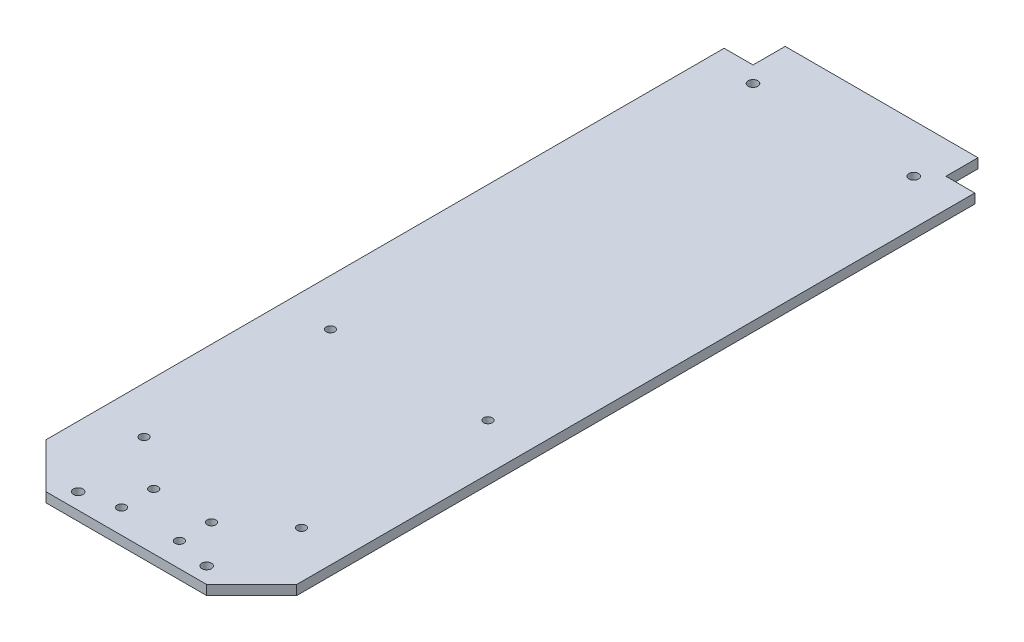
ISO-10303-21;
HEADER;
FILE_DESCRIPTION(('STEP AP214'),'2;1');
FILE_NAME('part.step','',(''),(''),'','','');
FILE_SCHEMA(('AUTOMOTIVE_DESIGN { 1 0 10303 214 1 1 1 1 }'));
ENDSEC;
DATA;
#1=APPLICATION_CONTEXT('core data for automotive mechanical design processes');
#2=APPLICATION_PROTOCOL_DEFINITION('international standard','automotive_design',2000,#1);
#3=PRODUCT_CONTEXT('',#1,'mechanical');
#4=PRODUCT('Part','Part','',(#3));
#5=PRODUCT_RELATED_PRODUCT_CATEGORY('part','',(#4));
#6=PRODUCT_DEFINITION_FORMATION('','',#4);
#7=PRODUCT_DEFINITION_CONTEXT('part definition',#1,'design');
#8=PRODUCT_DEFINITION('design','',#6,#7);
#9=PRODUCT_DEFINITION_SHAPE('','',#8);
#10=(LENGTH_UNIT() NAMED_UNIT(*) SI_UNIT(.MILLI.,.METRE.));
#11=(NAMED_UNIT(*) PLANE_ANGLE_UNIT() SI_UNIT($,.RADIAN.));
#12=(NAMED_UNIT(*) SI_UNIT($,.STERADIAN.) SOLID_ANGLE_UNIT());
#13=UNCERTAINTY_MEASURE_WITH_UNIT(LENGTH_MEASURE(1.E-05),#10,'distance_accuracy_value','');
#14=(GEOMETRIC_REPRESENTATION_CONTEXT(3) GLOBAL_UNCERTAINTY_ASSIGNED_CONTEXT((#13)) GLOBAL_UNIT_ASSIGNED_CONTEXT((#10,
#11,#12)) REPRESENTATION_CONTEXT('',''));
#15=CARTESIAN_POINT('',(0.,0.,0.));
#16=DIRECTION('',(0.,0.,1.));
#17=DIRECTION('',(1.,0.,0.));
#18=AXIS2_PLACEMENT_3D('',#15,#16,#17);
#19=CARTESIAN_POINT('',(28.1206219769056,3.,-112.5));
#20=DIRECTION('',(-1.,0.,0.));
#21=DIRECTION('',(0.,0.,1.));
#22=AXIS2_PLACEMENT_3D('',#19,#20,#21);
#23=PLANE('',#22);
#24=DIRECTION('',(0.,0.,-1.));
#25=VECTOR('',#24,1.);
#26=CARTESIAN_POINT('',(28.1206219769056,3.,-112.5));
#27=LINE('',#26,#25);
#28=CARTESIAN_POINT('',(28.1206219769056,3.,98.5));
#29=VERTEX_POINT('',#28);
#30=CARTESIAN_POINT('',(28.1206219769056,3.,-112.5));
#31=VERTEX_POINT('',#30);
#32=EDGE_CURVE('E111',#29,#31,#27,.T.);
#33=ORIENTED_EDGE('',*,*,#32,.F.);
#34=DIRECTION('',(0.,-1.,0.));
#35=VECTOR('',#34,1.);
#36=CARTESIAN_POINT('',(28.1206219769056,3.,98.5));
#37=LINE('',#36,#35);
#38=CARTESIAN_POINT('',(28.1206219769056,0.,98.5));
#39=VERTEX_POINT('',#38);
#40=EDGE_CURVE('E11',#29,#39,#37,.T.);
#41=ORIENTED_EDGE('',*,*,#40,.T.);
#42=DIRECTION('',(0.,0.,-1.));
#43=VECTOR('',#42,1.);
#44=CARTESIAN_POINT('',(28.1206219769056,0.,-112.5));
#45=LINE('',#44,#43);
#46=CARTESIAN_POINT('',(28.1206219769056,0.,-112.5));
#47=VERTEX_POINT('',#46);
#48=EDGE_CURVE('E131',#39,#47,#45,.T.);
#49=ORIENTED_EDGE('',*,*,#48,.T.);
#50=DIRECTION('',(0.,-1.,0.));
#51=VECTOR('',#50,1.);
#52=CARTESIAN_POINT('',(28.1206219769056,3.,-112.5));
#53=LINE('',#52,#51);
#54=EDGE_CURVE('E124',#31,#47,#53,.T.);
#55=ORIENTED_EDGE('',*,*,#54,.F.);
#56=EDGE_LOOP('',(#33,#41,#49,#55));
#57=FACE_BOUND('',#56,.T.);
#58=ADVANCED_FACE('F34',(#57),#23,.F.);
#59=CARTESIAN_POINT('',(19.1206219769056,3.,-112.5));
#60=DIRECTION('',(0.,0.,1.));
#61=DIRECTION('',(1.,0.,0.));
#62=AXIS2_PLACEMENT_3D('',#59,#60,#61);
#63=PLANE('',#62);
#64=DIRECTION('',(-1.,0.,0.));
#65=VECTOR('',#64,1.);
#66=CARTESIAN_POINT('',(19.1206219769056,0.,-112.5));
#67=LINE('',#66,#65);
#68=CARTESIAN_POINT('',(19.1206219769056,0.,-112.5));
#69=VERTEX_POINT('',#68);
#70=EDGE_CURVE('E234',#47,#69,#67,.T.);
#71=ORIENTED_EDGE('',*,*,#70,.T.);
#72=DIRECTION('',(0.,-1.,0.));
#73=VECTOR('',#72,1.);
#74=CARTESIAN_POINT('',(19.1206219769056,3.,-112.5));
#75=LINE('',#74,#73);
#76=CARTESIAN_POINT('',(19.1206219769056,3.,-112.5));
#77=VERTEX_POINT('',#76);
#78=EDGE_CURVE('E126',#77,#69,#75,.T.);
#79=ORIENTED_EDGE('',*,*,#78,.F.);
#80=DIRECTION('',(-1.,0.,0.));
#81=VECTOR('',#80,1.);
#82=CARTESIAN_POINT('',(19.1206219769056,3.,-112.5));
#83=LINE('',#82,#81);
#84=EDGE_CURVE('E114',#31,#77,#83,.T.);
#85=ORIENTED_EDGE('',*,*,#84,.F.);
#86=ORIENTED_EDGE('',*,*,#54,.T.);
#87=EDGE_LOOP('',(#71,#79,#85,#86));
#88=FACE_BOUND('',#87,.T.);
#89=ADVANCED_FACE('F123',(#88),#63,.F.);
#90=CARTESIAN_POINT('',(19.1206219769056,3.,-112.5));
#91=DIRECTION('',(-1.,0.,0.));
#92=DIRECTION('',(0.,0.,1.));
#93=AXIS2_PLACEMENT_3D('',#90,#91,#92);
#94=PLANE('',#93);
#95=DIRECTION('',(0.,0.,-1.));
#96=VECTOR('',#95,1.);
#97=CARTESIAN_POINT('',(19.1206219769056,0.,-112.5));
#98=LINE('',#97,#96);
#99=CARTESIAN_POINT('',(19.1206219769056,0.,-122.5));
#100=VERTEX_POINT('',#99);
#101=EDGE_CURVE('E232',#69,#100,#98,.T.);
#102=ORIENTED_EDGE('',*,*,#101,.T.);
#103=DIRECTION('',(0.,-1.,0.));
#104=VECTOR('',#103,1.);
#105=CARTESIAN_POINT('',(19.1206219769056,3.,-122.5));
#106=LINE('',#105,#104);
#107=CARTESIAN_POINT('',(19.1206219769056,3.,-122.5));
#108=VERTEX_POINT('',#107);
#109=EDGE_CURVE('E137',#108,#100,#106,.T.);
#110=ORIENTED_EDGE('',*,*,#109,.F.);
#111=DIRECTION('',(0.,0.,-1.));
#112=VECTOR('',#111,1.);
#113=CARTESIAN_POINT('',(19.1206219769056,3.,-112.5));
#114=LINE('',#113,#112);
#115=EDGE_CURVE('E128',#77,#108,#114,.T.);
#116=ORIENTED_EDGE('',*,*,#115,.F.);
#117=ORIENTED_EDGE('',*,*,#78,.T.);
#118=EDGE_LOOP('',(#102,#110,#116,#117));
#119=FACE_BOUND('',#118,.T.);
#120=ADVANCED_FACE('F314',(#119),#94,.F.);
#121=CARTESIAN_POINT('',(-40.8793780230944,3.,-122.5));
#122=DIRECTION('',(0.,0.,1.));
#123=DIRECTION('',(1.,0.,0.));
#124=AXIS2_PLACEMENT_3D('',#121,#122,#123);
#125=PLANE('',#124);
#126=DIRECTION('',(-1.,0.,0.));
#127=VECTOR('',#126,1.);
#128=CARTESIAN_POINT('',(-40.8793780230944,0.,-122.5));
#129=LINE('',#128,#127);
#130=CARTESIAN_POINT('',(-40.8793780230944,0.,-122.5));
#131=VERTEX_POINT('',#130);
#132=EDGE_CURVE('E227',#100,#131,#129,.T.);
#133=ORIENTED_EDGE('',*,*,#132,.T.);
#134=DIRECTION('',(0.,-1.,0.));
#135=VECTOR('',#134,1.);
#136=CARTESIAN_POINT('',(-40.8793780230944,3.,-122.5));
#137=LINE('',#136,#135);
#138=CARTESIAN_POINT('',(-40.8793780230944,3.,-122.5));
#139=VERTEX_POINT('',#138);
#140=EDGE_CURVE('E218',#139,#131,#137,.T.);
#141=ORIENTED_EDGE('',*,*,#140,.F.);
#142=DIRECTION('',(-1.,0.,0.));
#143=VECTOR('',#142,1.);
#144=CARTESIAN_POINT('',(-40.8793780230944,3.,-122.5));
#145=LINE('',#144,#143);
#146=EDGE_CURVE('E228',#108,#139,#145,.T.);
#147=ORIENTED_EDGE('',*,*,#146,.F.);
#148=ORIENTED_EDGE('',*,*,#109,.T.);
#149=EDGE_LOOP('',(#133,#141,#147,#148));
#150=FACE_BOUND('',#149,.T.);
#151=ADVANCED_FACE('F225',(#150),#125,.F.);
#152=CARTESIAN_POINT('',(-40.8793780230944,3.,-112.5));
#153=DIRECTION('',(1.,0.,0.));
#154=DIRECTION('',(0.,0.,-1.));
#155=AXIS2_PLACEMENT_3D('',#152,#153,#154);
#156=PLANE('',#155);
#157=DIRECTION('',(0.,0.,1.));
#158=VECTOR('',#157,1.);
#159=CARTESIAN_POINT('',(-40.8793780230944,0.,-112.5));
#160=LINE('',#159,#158);
#161=CARTESIAN_POINT('',(-40.8793780230944,0.,-112.5));
#162=VERTEX_POINT('',#161);
#163=EDGE_CURVE('E210',#131,#162,#160,.T.);
#164=ORIENTED_EDGE('',*,*,#163,.T.);
#165=DIRECTION('',(0.,-1.,0.));
#166=VECTOR('',#165,1.);
#167=CARTESIAN_POINT('',(-40.8793780230944,3.,-112.5));
#168=LINE('',#167,#166);
#169=CARTESIAN_POINT('',(-40.8793780230944,3.,-112.5));
#170=VERTEX_POINT('',#169);
#171=EDGE_CURVE('E215',#170,#162,#168,.T.);
#172=ORIENTED_EDGE('',*,*,#171,.F.);
#173=DIRECTION('',(0.,0.,1.));
#174=VECTOR('',#173,1.);
#175=CARTESIAN_POINT('',(-40.8793780230944,3.,-112.5));
#176=LINE('',#175,#174);
#177=EDGE_CURVE('E242',#139,#170,#176,.T.);
#178=ORIENTED_EDGE('',*,*,#177,.F.);
#179=ORIENTED_EDGE('',*,*,#140,.T.);
#180=EDGE_LOOP('',(#164,#172,#178,#179));
#181=FACE_BOUND('',#180,.T.);
#182=ADVANCED_FACE('F519',(#181),#156,.F.);
#183=CARTESIAN_POINT('',(-49.8793780230944,3.,-112.5));
#184=DIRECTION('',(0.,0.,1.));
#185=DIRECTION('',(1.,0.,0.));
#186=AXIS2_PLACEMENT_3D('',#183,#184,#185);
#187=PLANE('',#186);
#188=DIRECTION('',(-1.,0.,0.));
#189=VECTOR('',#188,1.);
#190=CARTESIAN_POINT('',(-49.8793780230944,0.,-112.5));
#191=LINE('',#190,#189);
#192=CARTESIAN_POINT('',(-49.8793780230944,0.,-112.5));
#193=VERTEX_POINT('',#192);
#194=EDGE_CURVE('E207',#162,#193,#191,.T.);
#195=ORIENTED_EDGE('',*,*,#194,.T.);
#196=DIRECTION('',(0.,-1.,0.));
#197=VECTOR('',#196,1.);
#198=CARTESIAN_POINT('',(-49.8793780230944,3.,-112.5));
#199=LINE('',#198,#197);
#200=CARTESIAN_POINT('',(-49.8793780230944,3.,-112.5));
#201=VERTEX_POINT('',#200);
#202=EDGE_CURVE('E196',#201,#193,#199,.T.);
#203=ORIENTED_EDGE('',*,*,#202,.F.);
#204=DIRECTION('',(-1.,0.,0.));
#205=VECTOR('',#204,1.);
#206=CARTESIAN_POINT('',(-49.8793780230944,3.,-112.5));
#207=LINE('',#206,#205);
#208=EDGE_CURVE('E240',#170,#201,#207,.T.);
#209=ORIENTED_EDGE('',*,*,#208,.F.);
#210=ORIENTED_EDGE('',*,*,#171,.T.);
#211=EDGE_LOOP('',(#195,#203,#209,#210));
#212=FACE_BOUND('',#211,.T.);
#213=ADVANCED_FACE('F433',(#212),#187,.F.);
#214=CARTESIAN_POINT('',(-49.8793780230944,3.,-112.5));
#215=DIRECTION('',(1.,0.,0.));
#216=DIRECTION('',(0.,0.,-1.));
#217=AXIS2_PLACEMENT_3D('',#214,#215,#216);
#218=PLANE('',#217);
#219=DIRECTION('',(0.,0.,1.));
#220=VECTOR('',#219,1.);
#221=CARTESIAN_POINT('',(-49.8793780230944,0.,-112.5));
#222=LINE('',#221,#220);
#223=CARTESIAN_POINT('',(-49.8793780230944,0.,98.4999999999999));
#224=VERTEX_POINT('',#223);
#225=EDGE_CURVE('E203',#193,#224,#222,.T.);
#226=ORIENTED_EDGE('',*,*,#225,.T.);
#227=DIRECTION('',(0.,1.,0.));
#228=VECTOR('',#227,1.);
#229=CARTESIAN_POINT('',(-49.8793780230944,3.,98.4999999999999));
#230=LINE('',#229,#228);
#231=CARTESIAN_POINT('',(-49.8793780230944,3.,98.4999999999999));
#232=VERTEX_POINT('',#231);
#233=EDGE_CURVE('E57',#224,#232,#230,.T.);
#234=ORIENTED_EDGE('',*,*,#233,.T.);
#235=DIRECTION('',(0.,0.,1.));
#236=VECTOR('',#235,1.);
#237=CARTESIAN_POINT('',(-49.8793780230944,3.,-112.5));
#238=LINE('',#237,#236);
#239=EDGE_CURVE('E188',#201,#232,#238,.T.);
#240=ORIENTED_EDGE('',*,*,#239,.F.);
#241=ORIENTED_EDGE('',*,*,#202,.T.);
#242=EDGE_LOOP('',(#226,#234,#240,#241));
#243=FACE_BOUND('',#242,.T.);
#244=ADVANCED_FACE('F205',(#243),#218,.F.);
#245=CARTESIAN_POINT('',(-49.8793780230944,3.,112.5));
#246=DIRECTION('',(0.,0.,-1.));
#247=DIRECTION('',(-1.,0.,0.));
#248=AXIS2_PLACEMENT_3D('',#245,#246,#247);
#249=PLANE('',#248);
#250=DIRECTION('',(1.,0.,0.));
#251=VECTOR('',#250,1.);
#252=CARTESIAN_POINT('',(-49.8793780230944,3.,112.5));
#253=LINE('',#252,#251);
#254=CARTESIAN_POINT('',(-35.8793780230944,3.,112.5));
#255=VERTEX_POINT('',#254);
#256=CARTESIAN_POINT('',(14.1206219769056,3.,112.5));
#257=VERTEX_POINT('',#256);
#258=EDGE_CURVE('E187',#255,#257,#253,.T.);
#259=ORIENTED_EDGE('',*,*,#258,.F.);
#260=DIRECTION('',(0.,-1.,0.));
#261=VECTOR('',#260,1.);
#262=CARTESIAN_POINT('',(-35.8793780230944,3.,112.5));
#263=LINE('',#262,#261);
#264=CARTESIAN_POINT('',(-35.8793780230944,0.,112.5));
#265=VERTEX_POINT('',#264);
#266=EDGE_CURVE('E135',#255,#265,#263,.T.);
#267=ORIENTED_EDGE('',*,*,#266,.T.);
#268=DIRECTION('',(1.,0.,0.));
#269=VECTOR('',#268,1.);
#270=CARTESIAN_POINT('',(-49.8793780230944,0.,112.5));
#271=LINE('',#270,#269);
#272=CARTESIAN_POINT('',(14.1206219769056,0.,112.5));
#273=VERTEX_POINT('',#272);
#274=EDGE_CURVE('E119',#265,#273,#271,.T.);
#275=ORIENTED_EDGE('',*,*,#274,.T.);
#276=DIRECTION('',(0.,1.,0.));
#277=VECTOR('',#276,1.);
#278=CARTESIAN_POINT('',(14.1206219769056,3.,112.5));
#279=LINE('',#278,#277);
#280=EDGE_CURVE('E133',#273,#257,#279,.T.);
#281=ORIENTED_EDGE('',*,*,#280,.T.);
#282=EDGE_LOOP('',(#259,#267,#275,#281));
#283=FACE_BOUND('',#282,.T.);
#284=ADVANCED_FACE('F192',(#283),#249,.F.);
#285=CARTESIAN_POINT('',(0.,3.,0.));
#286=DIRECTION('',(0.,1.,0.));
#287=DIRECTION('',(0.,0.,1.));
#288=AXIS2_PLACEMENT_3D('',#285,#286,#287);
#289=PLANE('',#288);
#290=CARTESIAN_POINT('',(-1.87937802309441,3.,105.));
#291=DIRECTION('',(0.,1.,0.));
#292=DIRECTION('',(0.,0.,1.));
#293=AXIS2_PLACEMENT_3D('',#290,#291,#292);
#294=CIRCLE('',#293,1.35);
#295=CARTESIAN_POINT('',(-1.87937802309441,3.,106.35));
#296=VERTEX_POINT('',#295);
#297=EDGE_CURVE('E261',#296,#296,#294,.T.);
#298=ORIENTED_EDGE('',*,*,#297,.F.);
#299=EDGE_LOOP('',(#298));
#300=FACE_BOUND('',#299,.T.);
#301=CARTESIAN_POINT('',(-35.3793780230944,3.,24.5));
#302=DIRECTION('',(0.,1.,0.));
#303=DIRECTION('',(0.,0.,1.));
#304=AXIS2_PLACEMENT_3D('',#301,#302,#303);
#305=CIRCLE('',#304,1.35);
#306=CARTESIAN_POINT('',(-35.3793780230944,3.,25.85));
#307=VERTEX_POINT('',#306);
#308=EDGE_CURVE('E264',#307,#307,#305,.T.);
#309=ORIENTED_EDGE('',*,*,#308,.F.);
#310=EDGE_LOOP('',(#309));
#311=FACE_BOUND('',#310,.T.);
#312=CARTESIAN_POINT('',(13.6206219769056,3.,24.5));
#313=DIRECTION('',(0.,1.,0.));
#314=DIRECTION('',(0.,0.,1.));
#315=AXIS2_PLACEMENT_3D('',#312,#313,#314);
#316=CIRCLE('',#315,1.35);
#317=CARTESIAN_POINT('',(13.6206219769056,3.,25.85));
#318=VERTEX_POINT('',#317);
#319=EDGE_CURVE('E268',#318,#318,#316,.T.);
#320=ORIENTED_EDGE('',*,*,#319,.F.);
#321=EDGE_LOOP('',(#320));
#322=FACE_BOUND('',#321,.T.);
#323=CARTESIAN_POINT('',(13.6206219769056,3.,82.5));
#324=DIRECTION('',(0.,1.,0.));
#325=DIRECTION('',(0.,0.,1.));
#326=AXIS2_PLACEMENT_3D('',#323,#324,#325);
#327=CIRCLE('',#326,1.35);
#328=CARTESIAN_POINT('',(13.6206219769056,3.,83.85));
#329=VERTEX_POINT('',#328);
#330=EDGE_CURVE('E258',#329,#329,#327,.T.);
#331=ORIENTED_EDGE('',*,*,#330,.F.);
#332=EDGE_LOOP('',(#331));
#333=FACE_BOUND('',#332,.T.);
#334=CARTESIAN_POINT('',(-35.8793780230944,3.,-107.5));
#335=DIRECTION('',(0.,1.,0.));
#336=DIRECTION('',(0.,0.,1.));
#337=AXIS2_PLACEMENT_3D('',#334,#335,#336);
#338=CIRCLE('',#337,1.5);
#339=CARTESIAN_POINT('',(-35.8793780230944,3.,-106.));
#340=VERTEX_POINT('',#339);
#341=EDGE_CURVE('E248',#340,#340,#338,.T.);
#342=ORIENTED_EDGE('',*,*,#341,.F.);
#343=EDGE_LOOP('',(#342));
#344=FACE_BOUND('',#343,.T.);
#345=CARTESIAN_POINT('',(9.12062197690559,3.,107.5));
#346=DIRECTION('',(0.,1.,0.));
#347=DIRECTION('',(0.,0.,1.));
#348=AXIS2_PLACEMENT_3D('',#345,#346,#347);
#349=CIRCLE('',#348,1.5);
#350=CARTESIAN_POINT('',(9.12062197690559,3.,109.));
#351=VERTEX_POINT('',#350);
#352=EDGE_CURVE('E249',#351,#351,#349,.T.);
#353=ORIENTED_EDGE('',*,*,#352,.F.);
#354=EDGE_LOOP('',(#353));
#355=FACE_BOUND('',#354,.T.);
#356=CARTESIAN_POINT('',(-30.8793780230944,3.,107.5));
#357=DIRECTION('',(0.,1.,0.));
#358=DIRECTION('',(0.,0.,1.));
#359=AXIS2_PLACEMENT_3D('',#356,#357,#358);
#360=CIRCLE('',#359,1.5);
#361=CARTESIAN_POINT('',(-30.8793780230944,3.,109.));
#362=VERTEX_POINT('',#361);
#363=EDGE_CURVE('E252',#362,#362,#360,.T.);
#364=ORIENTED_EDGE('',*,*,#363,.F.);
#365=EDGE_LOOP('',(#364));
#366=FACE_BOUND('',#365,.T.);
#367=CARTESIAN_POINT('',(-35.3793780230944,3.,82.5));
#368=DIRECTION('',(0.,1.,0.));
#369=DIRECTION('',(0.,0.,1.));
#370=AXIS2_PLACEMENT_3D('',#367,#368,#369);
#371=CIRCLE('',#370,1.35);
#372=CARTESIAN_POINT('',(-35.3793780230944,3.,83.85));
#373=VERTEX_POINT('',#372);
#374=EDGE_CURVE('E255',#373,#373,#371,.T.);
#375=ORIENTED_EDGE('',*,*,#374,.F.);
#376=EDGE_LOOP('',(#375));
#377=FACE_BOUND('',#376,.T.);
#378=CARTESIAN_POINT('',(-19.8793780230944,3.,95.));
#379=DIRECTION('',(0.,1.,0.));
#380=DIRECTION('',(0.,0.,1.));
#381=AXIS2_PLACEMENT_3D('',#378,#379,#380);
#382=CIRCLE('',#381,1.35);
#383=CARTESIAN_POINT('',(-19.8793780230944,3.,96.35));
#384=VERTEX_POINT('',#383);
#385=EDGE_CURVE('E265',#384,#384,#382,.T.);
#386=ORIENTED_EDGE('',*,*,#385,.F.);
#387=EDGE_LOOP('',(#386));
#388=FACE_BOUND('',#387,.T.);
#389=CARTESIAN_POINT('',(-19.8793780230944,3.,105.));
#390=DIRECTION('',(0.,1.,0.));
#391=DIRECTION('',(0.,0.,1.));
#392=AXIS2_PLACEMENT_3D('',#389,#390,#391);
#393=CIRCLE('',#392,1.35);
#394=CARTESIAN_POINT('',(-19.8793780230944,3.,106.35));
#395=VERTEX_POINT('',#394);
#396=EDGE_CURVE('E276',#395,#395,#393,.T.);
#397=ORIENTED_EDGE('',*,*,#396,.F.);
#398=EDGE_LOOP('',(#397));
#399=FACE_BOUND('',#398,.T.);
#400=CARTESIAN_POINT('',(-1.87937802309441,3.,95.));
#401=DIRECTION('',(0.,1.,0.));
#402=DIRECTION('',(0.,0.,1.));
#403=AXIS2_PLACEMENT_3D('',#400,#401,#402);
#404=CIRCLE('',#403,1.35);
#405=CARTESIAN_POINT('',(-1.87937802309441,3.,96.35));
#406=VERTEX_POINT('',#405);
#407=EDGE_CURVE('E273',#406,#406,#404,.T.);
#408=ORIENTED_EDGE('',*,*,#407,.F.);
#409=EDGE_LOOP('',(#408));
#410=FACE_BOUND('',#409,.T.);
#411=CARTESIAN_POINT('',(14.1206219769056,3.,-107.5));
#412=DIRECTION('',(0.,1.,0.));
#413=DIRECTION('',(0.,0.,1.));
#414=AXIS2_PLACEMENT_3D('',#411,#412,#413);
#415=CIRCLE('',#414,1.5);
#416=CARTESIAN_POINT('',(14.1206219769056,3.,-106.));
#417=VERTEX_POINT('',#416);
#418=EDGE_CURVE('E145',#417,#417,#415,.T.);
#419=ORIENTED_EDGE('',*,*,#418,.F.);
#420=EDGE_LOOP('',(#419));
#421=FACE_BOUND('',#420,.T.);
#422=ORIENTED_EDGE('',*,*,#239,.T.);
#423=DIRECTION('',(-0.707106781186545,0.,-0.70710678118655));
#424=VECTOR('',#423,1.);
#425=CARTESIAN_POINT('',(-74.1896890115473,3.,74.1896890115468));
#426=LINE('',#425,#424);
#427=EDGE_CURVE('E42',#232,#255,#426,.F.);
#428=ORIENTED_EDGE('',*,*,#427,.T.);
#429=ORIENTED_EDGE('',*,*,#258,.T.);
#430=DIRECTION('',(-0.707106781186549,0.,0.707106781186546));
#431=VECTOR('',#430,1.);
#432=CARTESIAN_POINT('',(63.3103109884528,3.,63.310310988453));
#433=LINE('',#432,#431);
#434=EDGE_CURVE('E49',#257,#29,#433,.F.);
#435=ORIENTED_EDGE('',*,*,#434,.T.);
#436=ORIENTED_EDGE('',*,*,#32,.T.);
#437=ORIENTED_EDGE('',*,*,#84,.T.);
#438=ORIENTED_EDGE('',*,*,#115,.T.);
#439=ORIENTED_EDGE('',*,*,#146,.T.);
#440=ORIENTED_EDGE('',*,*,#177,.T.);
#441=ORIENTED_EDGE('',*,*,#208,.T.);
#442=EDGE_LOOP('',(#422,#428,#429,#435,#436,#437,#438,#439,#440,#441));
#443=FACE_BOUND('',#442,.T.);
#444=ADVANCED_FACE('F113',(#300,#311,#322,#333,#344,#355,#366,#377,#388,#399,#410,#421,#443),
#289,.T.);
#445=CARTESIAN_POINT('',(0.,0.,0.));
#446=DIRECTION('',(0.,1.,0.));
#447=DIRECTION('',(0.,0.,1.));
#448=AXIS2_PLACEMENT_3D('',#445,#446,#447);
#449=PLANE('',#448);
#450=CARTESIAN_POINT('',(-1.87937802309441,0.,105.));
#451=DIRECTION('',(0.,1.,0.));
#452=DIRECTION('',(0.,0.,1.));
#453=AXIS2_PLACEMENT_3D('',#450,#451,#452);
#454=CIRCLE('',#453,1.35);
#455=CARTESIAN_POINT('',(-1.87937802309441,0.,106.35));
#456=VERTEX_POINT('',#455);
#457=EDGE_CURVE('E175',#456,#456,#454,.T.);
#458=ORIENTED_EDGE('',*,*,#457,.T.);
#459=EDGE_LOOP('',(#458));
#460=FACE_BOUND('',#459,.T.);
#461=CARTESIAN_POINT('',(-35.3793780230944,0.,24.5));
#462=DIRECTION('',(0.,1.,0.));
#463=DIRECTION('',(0.,0.,1.));
#464=AXIS2_PLACEMENT_3D('',#461,#462,#463);
#465=CIRCLE('',#464,1.35);
#466=CARTESIAN_POINT('',(-35.3793780230944,0.,25.85));
#467=VERTEX_POINT('',#466);
#468=EDGE_CURVE('E172',#467,#467,#465,.T.);
#469=ORIENTED_EDGE('',*,*,#468,.T.);
#470=EDGE_LOOP('',(#469));
#471=FACE_BOUND('',#470,.T.);
#472=CARTESIAN_POINT('',(13.6206219769056,0.,24.5));
#473=DIRECTION('',(0.,1.,0.));
#474=DIRECTION('',(0.,0.,1.));
#475=AXIS2_PLACEMENT_3D('',#472,#473,#474);
#476=CIRCLE('',#475,1.35);
#477=CARTESIAN_POINT('',(13.6206219769056,0.,25.85));
#478=VERTEX_POINT('',#477);
#479=EDGE_CURVE('E169',#478,#478,#476,.T.);
#480=ORIENTED_EDGE('',*,*,#479,.T.);
#481=EDGE_LOOP('',(#480));
#482=FACE_BOUND('',#481,.T.);
#483=CARTESIAN_POINT('',(13.6206219769056,0.,82.5));
#484=DIRECTION('',(0.,1.,0.));
#485=DIRECTION('',(0.,0.,1.));
#486=AXIS2_PLACEMENT_3D('',#483,#484,#485);
#487=CIRCLE('',#486,1.35);
#488=CARTESIAN_POINT('',(13.6206219769056,0.,83.85));
#489=VERTEX_POINT('',#488);
#490=EDGE_CURVE('E166',#489,#489,#487,.T.);
#491=ORIENTED_EDGE('',*,*,#490,.T.);
#492=EDGE_LOOP('',(#491));
#493=FACE_BOUND('',#492,.T.);
#494=CARTESIAN_POINT('',(-35.8793780230944,0.,-107.5));
#495=DIRECTION('',(0.,1.,0.));
#496=DIRECTION('',(0.,0.,1.));
#497=AXIS2_PLACEMENT_3D('',#494,#495,#496);
#498=CIRCLE('',#497,1.5);
#499=CARTESIAN_POINT('',(-35.8793780230944,0.,-106.));
#500=VERTEX_POINT('',#499);
#501=EDGE_CURVE('E163',#500,#500,#498,.T.);
#502=ORIENTED_EDGE('',*,*,#501,.T.);
#503=EDGE_LOOP('',(#502));
#504=FACE_BOUND('',#503,.T.);
#505=CARTESIAN_POINT('',(9.12062197690559,0.,107.5));
#506=DIRECTION('',(0.,1.,0.));
#507=DIRECTION('',(0.,0.,1.));
#508=AXIS2_PLACEMENT_3D('',#505,#506,#507);
#509=CIRCLE('',#508,1.5);
#510=CARTESIAN_POINT('',(9.12062197690559,0.,109.));
#511=VERTEX_POINT('',#510);
#512=EDGE_CURVE('E160',#511,#511,#509,.T.);
#513=ORIENTED_EDGE('',*,*,#512,.T.);
#514=EDGE_LOOP('',(#513));
#515=FACE_BOUND('',#514,.T.);
#516=CARTESIAN_POINT('',(-30.8793780230944,0.,107.5));
#517=DIRECTION('',(0.,1.,0.));
#518=DIRECTION('',(0.,0.,1.));
#519=AXIS2_PLACEMENT_3D('',#516,#517,#518);
#520=CIRCLE('',#519,1.5);
#521=CARTESIAN_POINT('',(-30.8793780230944,0.,109.));
#522=VERTEX_POINT('',#521);
#523=EDGE_CURVE('E157',#522,#522,#520,.T.);
#524=ORIENTED_EDGE('',*,*,#523,.T.);
#525=EDGE_LOOP('',(#524));
#526=FACE_BOUND('',#525,.T.);
#527=CARTESIAN_POINT('',(-35.3793780230944,0.,82.5));
#528=DIRECTION('',(0.,1.,0.));
#529=DIRECTION('',(0.,0.,1.));
#530=AXIS2_PLACEMENT_3D('',#527,#528,#529);
#531=CIRCLE('',#530,1.35);
#532=CARTESIAN_POINT('',(-35.3793780230944,0.,83.85));
#533=VERTEX_POINT('',#532);
#534=EDGE_CURVE('E154',#533,#533,#531,.T.);
#535=ORIENTED_EDGE('',*,*,#534,.T.);
#536=EDGE_LOOP('',(#535));
#537=FACE_BOUND('',#536,.T.);
#538=CARTESIAN_POINT('',(-19.8793780230944,0.,95.));
#539=DIRECTION('',(0.,1.,0.));
#540=DIRECTION('',(0.,0.,1.));
#541=AXIS2_PLACEMENT_3D('',#538,#539,#540);
#542=CIRCLE('',#541,1.35);
#543=CARTESIAN_POINT('',(-19.8793780230944,0.,96.35));
#544=VERTEX_POINT('',#543);
#545=EDGE_CURVE('E151',#544,#544,#542,.T.);
#546=ORIENTED_EDGE('',*,*,#545,.T.);
#547=EDGE_LOOP('',(#546));
#548=FACE_BOUND('',#547,.T.);
#549=CARTESIAN_POINT('',(-19.8793780230944,0.,105.));
#550=DIRECTION('',(0.,1.,0.));
#551=DIRECTION('',(0.,0.,1.));
#552=AXIS2_PLACEMENT_3D('',#549,#550,#551);
#553=CIRCLE('',#552,1.35);
#554=CARTESIAN_POINT('',(-19.8793780230944,0.,106.35));
#555=VERTEX_POINT('',#554);
#556=EDGE_CURVE('E148',#555,#555,#553,.T.);
#557=ORIENTED_EDGE('',*,*,#556,.T.);
#558=EDGE_LOOP('',(#557));
#559=FACE_BOUND('',#558,.T.);
#560=CARTESIAN_POINT('',(-1.87937802309441,0.,95.));
#561=DIRECTION('',(0.,1.,0.));
#562=DIRECTION('',(0.,0.,1.));
#563=AXIS2_PLACEMENT_3D('',#560,#561,#562);
#564=CIRCLE('',#563,1.35);
#565=CARTESIAN_POINT('',(-1.87937802309441,0.,96.35));
#566=VERTEX_POINT('',#565);
#567=EDGE_CURVE('E144',#566,#566,#564,.T.);
#568=ORIENTED_EDGE('',*,*,#567,.T.);
#569=EDGE_LOOP('',(#568));
#570=FACE_BOUND('',#569,.T.);
#571=CARTESIAN_POINT('',(14.1206219769056,0.,-107.5));
#572=DIRECTION('',(0.,1.,0.));
#573=DIRECTION('',(0.,0.,1.));
#574=AXIS2_PLACEMENT_3D('',#571,#572,#573);
#575=CIRCLE('',#574,1.5);
#576=CARTESIAN_POINT('',(14.1206219769056,0.,-106.));
#577=VERTEX_POINT('',#576);
#578=EDGE_CURVE('E141',#577,#577,#575,.T.);
#579=ORIENTED_EDGE('',*,*,#578,.T.);
#580=EDGE_LOOP('',(#579));
#581=FACE_BOUND('',#580,.T.);
#582=ORIENTED_EDGE('',*,*,#274,.F.);
#583=DIRECTION('',(0.707106781186545,0.,0.70710678118655));
#584=VECTOR('',#583,1.);
#585=CARTESIAN_POINT('',(-35.8793780230944,0.,112.5));
#586=LINE('',#585,#584);
#587=EDGE_CURVE('E182',#265,#224,#586,.F.);
#588=ORIENTED_EDGE('',*,*,#587,.T.);
#589=ORIENTED_EDGE('',*,*,#225,.F.);
#590=ORIENTED_EDGE('',*,*,#194,.F.);
#591=ORIENTED_EDGE('',*,*,#163,.F.);
#592=ORIENTED_EDGE('',*,*,#132,.F.);
#593=ORIENTED_EDGE('',*,*,#101,.F.);
#594=ORIENTED_EDGE('',*,*,#70,.F.);
#595=ORIENTED_EDGE('',*,*,#48,.F.);
#596=DIRECTION('',(0.707106781186549,0.,-0.707106781186546));
#597=VECTOR('',#596,1.);
#598=CARTESIAN_POINT('',(28.1206219769056,0.,98.5));
#599=LINE('',#598,#597);
#600=EDGE_CURVE('E180',#39,#273,#599,.F.);
#601=ORIENTED_EDGE('',*,*,#600,.T.);
#602=EDGE_LOOP('',(#582,#588,#589,#590,#591,#592,#593,#594,#595,#601));
#603=FACE_BOUND('',#602,.T.);
#604=ADVANCED_FACE('F201',(#460,#471,#482,#493,#504,#515,#526,#537,#548,#559,#570,#581,#603),
#449,.F.);
#605=CARTESIAN_POINT('',(14.1206219769056,-22.,-107.5));
#606=DIRECTION('',(0.,1.,0.));
#607=DIRECTION('',(0.,0.,1.));
#608=AXIS2_PLACEMENT_3D('',#605,#606,#607);
#609=CYLINDRICAL_SURFACE('',#608,1.5);
#610=ORIENTED_EDGE('',*,*,#418,.T.);
#611=EDGE_LOOP('',(#610));
#612=FACE_BOUND('',#611,.T.);
#613=ORIENTED_EDGE('',*,*,#578,.F.);
#614=EDGE_LOOP('',(#613));
#615=FACE_BOUND('',#614,.T.);
#616=ADVANCED_FACE('F295',(#612,#615),#609,.F.);
#617=CARTESIAN_POINT('',(-1.87937802309441,-22.,95.));
#618=DIRECTION('',(0.,1.,0.));
#619=DIRECTION('',(0.,0.,1.));
#620=AXIS2_PLACEMENT_3D('',#617,#618,#619);
#621=CYLINDRICAL_SURFACE('',#620,1.35);
#622=ORIENTED_EDGE('',*,*,#407,.T.);
#623=EDGE_LOOP('',(#622));
#624=FACE_BOUND('',#623,.T.);
#625=ORIENTED_EDGE('',*,*,#567,.F.);
#626=EDGE_LOOP('',(#625));
#627=FACE_BOUND('',#626,.T.);
#628=ADVANCED_FACE('F298',(#624,#627),#621,.F.);
#629=CARTESIAN_POINT('',(-19.8793780230944,-22.,105.));
#630=DIRECTION('',(0.,1.,0.));
#631=DIRECTION('',(0.,0.,1.));
#632=AXIS2_PLACEMENT_3D('',#629,#630,#631);
#633=CYLINDRICAL_SURFACE('',#632,1.35);
#634=ORIENTED_EDGE('',*,*,#396,.T.);
#635=EDGE_LOOP('',(#634));
#636=FACE_BOUND('',#635,.T.);
#637=ORIENTED_EDGE('',*,*,#556,.F.);
#638=EDGE_LOOP('',(#637));
#639=FACE_BOUND('',#638,.T.);
#640=ADVANCED_FACE('F370',(#636,#639),#633,.F.);
#641=CARTESIAN_POINT('',(-19.8793780230944,-22.,95.));
#642=DIRECTION('',(0.,1.,0.));
#643=DIRECTION('',(0.,0.,1.));
#644=AXIS2_PLACEMENT_3D('',#641,#642,#643);
#645=CYLINDRICAL_SURFACE('',#644,1.35);
#646=ORIENTED_EDGE('',*,*,#385,.T.);
#647=EDGE_LOOP('',(#646));
#648=FACE_BOUND('',#647,.T.);
#649=ORIENTED_EDGE('',*,*,#545,.F.);
#650=EDGE_LOOP('',(#649));
#651=FACE_BOUND('',#650,.T.);
#652=ADVANCED_FACE('F282',(#648,#651),#645,.F.);
#653=CARTESIAN_POINT('',(-35.3793780230944,-22.,82.5));
#654=DIRECTION('',(0.,1.,0.));
#655=DIRECTION('',(0.,0.,1.));
#656=AXIS2_PLACEMENT_3D('',#653,#654,#655);
#657=CYLINDRICAL_SURFACE('',#656,1.35);
#658=ORIENTED_EDGE('',*,*,#374,.T.);
#659=EDGE_LOOP('',(#658));
#660=FACE_BOUND('',#659,.T.);
#661=ORIENTED_EDGE('',*,*,#534,.F.);
#662=EDGE_LOOP('',(#661));
#663=FACE_BOUND('',#662,.T.);
#664=ADVANCED_FACE('F340',(#660,#663),#657,.F.);
#665=CARTESIAN_POINT('',(-30.8793780230944,-22.,107.5));
#666=DIRECTION('',(0.,1.,0.));
#667=DIRECTION('',(0.,0.,1.));
#668=AXIS2_PLACEMENT_3D('',#665,#666,#667);
#669=CYLINDRICAL_SURFACE('',#668,1.5);
#670=ORIENTED_EDGE('',*,*,#363,.T.);
#671=EDGE_LOOP('',(#670));
#672=FACE_BOUND('',#671,.T.);
#673=ORIENTED_EDGE('',*,*,#523,.F.);
#674=EDGE_LOOP('',(#673));
#675=FACE_BOUND('',#674,.T.);
#676=ADVANCED_FACE('F336',(#672,#675),#669,.F.);
#677=CARTESIAN_POINT('',(9.12062197690559,-22.,107.5));
#678=DIRECTION('',(0.,1.,0.));
#679=DIRECTION('',(0.,0.,1.));
#680=AXIS2_PLACEMENT_3D('',#677,#678,#679);
#681=CYLINDRICAL_SURFACE('',#680,1.5);
#682=ORIENTED_EDGE('',*,*,#352,.T.);
#683=EDGE_LOOP('',(#682));
#684=FACE_BOUND('',#683,.T.);
#685=ORIENTED_EDGE('',*,*,#512,.F.);
#686=EDGE_LOOP('',(#685));
#687=FACE_BOUND('',#686,.T.);
#688=ADVANCED_FACE('F339',(#684,#687),#681,.F.);
#689=CARTESIAN_POINT('',(-35.8793780230944,-22.,-107.5));
#690=DIRECTION('',(0.,1.,0.));
#691=DIRECTION('',(0.,0.,1.));
#692=AXIS2_PLACEMENT_3D('',#689,#690,#691);
#693=CYLINDRICAL_SURFACE('',#692,1.5);
#694=ORIENTED_EDGE('',*,*,#341,.T.);
#695=EDGE_LOOP('',(#694));
#696=FACE_BOUND('',#695,.T.);
#697=ORIENTED_EDGE('',*,*,#501,.F.);
#698=EDGE_LOOP('',(#697));
#699=FACE_BOUND('',#698,.T.);
#700=ADVANCED_FACE('F345',(#696,#699),#693,.F.);
#701=CARTESIAN_POINT('',(13.6206219769056,-22.,82.5));
#702=DIRECTION('',(0.,1.,0.));
#703=DIRECTION('',(0.,0.,1.));
#704=AXIS2_PLACEMENT_3D('',#701,#702,#703);
#705=CYLINDRICAL_SURFACE('',#704,1.35);
#706=ORIENTED_EDGE('',*,*,#330,.T.);
#707=EDGE_LOOP('',(#706));
#708=FACE_BOUND('',#707,.T.);
#709=ORIENTED_EDGE('',*,*,#490,.F.);
#710=EDGE_LOOP('',(#709));
#711=FACE_BOUND('',#710,.T.);
#712=ADVANCED_FACE('F348',(#708,#711),#705,.F.);
#713=CARTESIAN_POINT('',(13.6206219769056,-22.,24.5));
#714=DIRECTION('',(0.,1.,0.));
#715=DIRECTION('',(0.,0.,1.));
#716=AXIS2_PLACEMENT_3D('',#713,#714,#715);
#717=CYLINDRICAL_SURFACE('',#716,1.35);
#718=ORIENTED_EDGE('',*,*,#319,.T.);
#719=EDGE_LOOP('',(#718));
#720=FACE_BOUND('',#719,.T.);
#721=ORIENTED_EDGE('',*,*,#479,.F.);
#722=EDGE_LOOP('',(#721));
#723=FACE_BOUND('',#722,.T.);
#724=ADVANCED_FACE('F330',(#720,#723),#717,.F.);
#725=CARTESIAN_POINT('',(-35.3793780230944,-22.,24.5));
#726=DIRECTION('',(0.,1.,0.));
#727=DIRECTION('',(0.,0.,1.));
#728=AXIS2_PLACEMENT_3D('',#725,#726,#727);
#729=CYLINDRICAL_SURFACE('',#728,1.35);
#730=ORIENTED_EDGE('',*,*,#308,.T.);
#731=EDGE_LOOP('',(#730));
#732=FACE_BOUND('',#731,.T.);
#733=ORIENTED_EDGE('',*,*,#468,.F.);
#734=EDGE_LOOP('',(#733));
#735=FACE_BOUND('',#734,.T.);
#736=ADVANCED_FACE('F324',(#732,#735),#729,.F.);
#737=CARTESIAN_POINT('',(-1.87937802309441,-22.,105.));
#738=DIRECTION('',(0.,1.,0.));
#739=DIRECTION('',(0.,0.,1.));
#740=AXIS2_PLACEMENT_3D('',#737,#738,#739);
#741=CYLINDRICAL_SURFACE('',#740,1.35);
#742=ORIENTED_EDGE('',*,*,#297,.T.);
#743=EDGE_LOOP('',(#742));
#744=FACE_BOUND('',#743,.T.);
#745=ORIENTED_EDGE('',*,*,#457,.F.);
#746=EDGE_LOOP('',(#745));
#747=FACE_BOUND('',#746,.T.);
#748=ADVANCED_FACE('F318',(#744,#747),#741,.F.);
#749=CARTESIAN_POINT('',(-35.8793780230944,3.,112.5));
#750=DIRECTION('',(0.70710678118655,0.,-0.707106781186545));
#751=DIRECTION('',(0.,-1.,0.));
#752=AXIS2_PLACEMENT_3D('',#749,#750,#751);
#753=PLANE('',#752);
#754=ORIENTED_EDGE('',*,*,#427,.F.);
#755=ORIENTED_EDGE('',*,*,#233,.F.);
#756=ORIENTED_EDGE('',*,*,#587,.F.);
#757=ORIENTED_EDGE('',*,*,#266,.F.);
#758=EDGE_LOOP('',(#754,#755,#756,#757));
#759=FACE_BOUND('',#758,.T.);
#760=ADVANCED_FACE('F198',(#759),#753,.F.);
#761=CARTESIAN_POINT('',(28.1206219769056,3.,98.5));
#762=DIRECTION('',(-0.707106781186546,0.,-0.707106781186549));
#763=DIRECTION('',(0.,-1.,0.));
#764=AXIS2_PLACEMENT_3D('',#761,#762,#763);
#765=PLANE('',#764);
#766=ORIENTED_EDGE('',*,*,#434,.F.);
#767=ORIENTED_EDGE('',*,*,#280,.F.);
#768=ORIENTED_EDGE('',*,*,#600,.F.);
#769=ORIENTED_EDGE('',*,*,#40,.F.);
#770=EDGE_LOOP('',(#766,#767,#768,#769));
#771=FACE_BOUND('',#770,.T.);
#772=ADVANCED_FACE('F36',(#771),#765,.F.);
#773=CLOSED_SHELL('',(#58,#89,#120,#151,#182,#213,#244,#284,#444,#604,#616,#628,#640,#652,#664,
#676,#688,#700,#712,#724,#736,#748,#760,#772));
#774=MANIFOLD_SOLID_BREP('B2',#773);
#775=ADVANCED_BREP_SHAPE_REPRESENTATION('',(#18,#774),#14);
#776=SHAPE_DEFINITION_REPRESENTATION(#9,#775);
ENDSEC;
END-ISO-10303-21;
